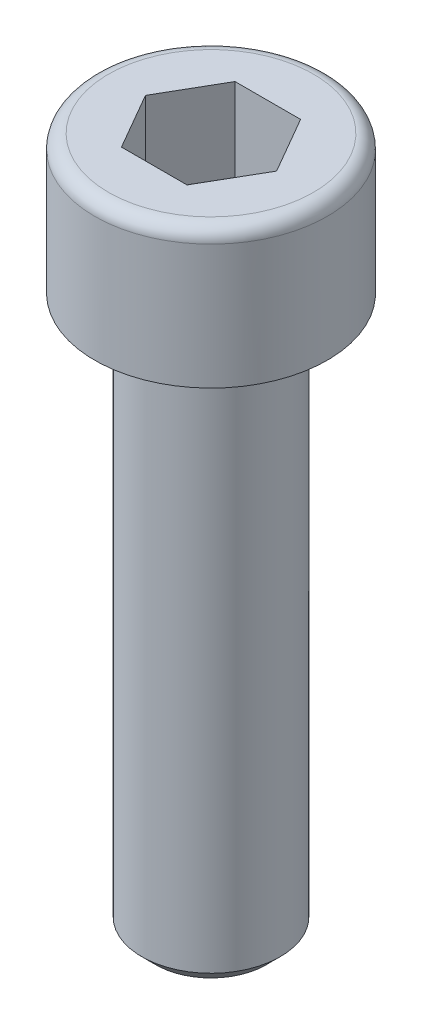
ISO-10303-21;
HEADER;
FILE_DESCRIPTION(('STEP AP214'),'2;1');
FILE_NAME('part.step','',(''),(''),'','','');
FILE_SCHEMA(('AUTOMOTIVE_DESIGN { 1 0 10303 214 1 1 1 1 }'));
ENDSEC;
DATA;
#1=APPLICATION_CONTEXT('core data for automotive mechanical design processes');
#2=APPLICATION_PROTOCOL_DEFINITION('international standard','automotive_design',2000,#1);
#3=PRODUCT_CONTEXT('',#1,'mechanical');
#4=PRODUCT('Part','Part','',(#3));
#5=PRODUCT_RELATED_PRODUCT_CATEGORY('part','',(#4));
#6=PRODUCT_DEFINITION_FORMATION('','',#4);
#7=PRODUCT_DEFINITION_CONTEXT('part definition',#1,'design');
#8=PRODUCT_DEFINITION('design','',#6,#7);
#9=PRODUCT_DEFINITION_SHAPE('','',#8);
#10=(LENGTH_UNIT() NAMED_UNIT(*) SI_UNIT(.MILLI.,.METRE.));
#11=(NAMED_UNIT(*) PLANE_ANGLE_UNIT() SI_UNIT($,.RADIAN.));
#12=(NAMED_UNIT(*) SI_UNIT($,.STERADIAN.) SOLID_ANGLE_UNIT());
#13=UNCERTAINTY_MEASURE_WITH_UNIT(LENGTH_MEASURE(1.E-05),#10,'distance_accuracy_value','');
#14=(GEOMETRIC_REPRESENTATION_CONTEXT(3) GLOBAL_UNCERTAINTY_ASSIGNED_CONTEXT((#13)) GLOBAL_UNIT_ASSIGNED_CONTEXT((#10,
#11,#12)) REPRESENTATION_CONTEXT('',''));
#15=CARTESIAN_POINT('',(0.,0.,0.));
#16=DIRECTION('',(0.,0.,1.));
#17=DIRECTION('',(1.,0.,0.));
#18=AXIS2_PLACEMENT_3D('',#15,#16,#17);
#19=CARTESIAN_POINT('',(0.,0.,0.));
#20=DIRECTION('',(0.,-1.,0.));
#21=DIRECTION('',(0.,0.,-1.));
#22=AXIS2_PLACEMENT_3D('',#19,#20,#21);
#23=PLANE('',#22);
#24=CARTESIAN_POINT('',(0.,0.,0.));
#25=DIRECTION('',(0.,-1.,0.));
#26=DIRECTION('',(0.,0.,-1.));
#27=AXIS2_PLACEMENT_3D('',#24,#25,#26);
#28=CIRCLE('',#27,4.2);
#29=CARTESIAN_POINT('',(0.,0.,-4.2));
#30=VERTEX_POINT('',#29);
#31=EDGE_CURVE('E142',#30,#30,#28,.T.);
#32=ORIENTED_EDGE('',*,*,#31,.T.);
#33=EDGE_LOOP('',(#32));
#34=FACE_BOUND('',#33,.T.);
#35=CARTESIAN_POINT('',(0.,0.,0.));
#36=DIRECTION('',(0.,-1.,0.));
#37=DIRECTION('',(0.,0.,-1.));
#38=AXIS2_PLACEMENT_3D('',#35,#36,#37);
#39=CIRCLE('',#38,2.5);
#40=CARTESIAN_POINT('',(0.,0.,-2.5));
#41=VERTEX_POINT('',#40);
#42=EDGE_CURVE('E134',#41,#41,#39,.T.);
#43=ORIENTED_EDGE('',*,*,#42,.F.);
#44=EDGE_LOOP('',(#43));
#45=FACE_BOUND('',#44,.T.);
#46=ADVANCED_FACE('F32',(#34,#45),#23,.T.);
#47=CARTESIAN_POINT('',(0.,5.,0.));
#48=DIRECTION('',(0.,-1.,0.));
#49=DIRECTION('',(0.,0.,-1.));
#50=AXIS2_PLACEMENT_3D('',#47,#48,#49);
#51=CYLINDRICAL_SURFACE('',#50,4.2);
#52=CARTESIAN_POINT('',(0.,4.5,0.));
#53=DIRECTION('',(0.,1.,0.));
#54=DIRECTION('',(0.,0.,1.));
#55=AXIS2_PLACEMENT_3D('',#52,#53,#54);
#56=CIRCLE('',#55,4.2);
#57=CARTESIAN_POINT('',(0.,4.5,4.2));
#58=VERTEX_POINT('',#57);
#59=EDGE_CURVE('E40',#58,#58,#56,.F.);
#60=ORIENTED_EDGE('',*,*,#59,.T.);
#61=EDGE_LOOP('',(#60));
#62=FACE_BOUND('',#61,.T.);
#63=ORIENTED_EDGE('',*,*,#31,.F.);
#64=EDGE_LOOP('',(#63));
#65=FACE_BOUND('',#64,.T.);
#66=ADVANCED_FACE('F153',(#62,#65),#51,.T.);
#67=CARTESIAN_POINT('',(4.2,5.,0.));
#68=DIRECTION('',(0.,1.,0.));
#69=DIRECTION('',(0.,0.,1.));
#70=AXIS2_PLACEMENT_3D('',#67,#68,#69);
#71=PLANE('',#70);
#72=CARTESIAN_POINT('',(0.,5.,0.));
#73=DIRECTION('',(0.,1.,0.));
#74=DIRECTION('',(0.,0.,1.));
#75=AXIS2_PLACEMENT_3D('',#72,#73,#74);
#76=CIRCLE('',#75,3.7);
#77=CARTESIAN_POINT('',(0.,5.,3.7));
#78=VERTEX_POINT('',#77);
#79=EDGE_CURVE('E11',#78,#78,#76,.T.);
#80=ORIENTED_EDGE('',*,*,#79,.T.);
#81=EDGE_LOOP('',(#80));
#82=FACE_BOUND('',#81,.T.);
#83=DIRECTION('',(0.5,0.,0.866025403784439));
#84=VECTOR('',#83,1.);
#85=CARTESIAN_POINT('',(-2.36713610367747,5.,0.));
#86=LINE('',#85,#84);
#87=CARTESIAN_POINT('',(-2.36713610367747,5.,0.));
#88=VERTEX_POINT('',#87);
#89=CARTESIAN_POINT('',(-1.18356805183873,5.,2.05));
#90=VERTEX_POINT('',#89);
#91=EDGE_CURVE('E47',#88,#90,#86,.T.);
#92=ORIENTED_EDGE('',*,*,#91,.F.);
#93=DIRECTION('',(-0.5,0.,0.866025403784439));
#94=VECTOR('',#93,1.);
#95=CARTESIAN_POINT('',(-1.18356805183873,5.,-2.05));
#96=LINE('',#95,#94);
#97=CARTESIAN_POINT('',(-1.18356805183873,5.,-2.05));
#98=VERTEX_POINT('',#97);
#99=EDGE_CURVE('E130',#98,#88,#96,.T.);
#100=ORIENTED_EDGE('',*,*,#99,.F.);
#101=DIRECTION('',(-1.,0.,0.));
#102=VECTOR('',#101,1.);
#103=CARTESIAN_POINT('',(1.18356805183873,5.,-2.05));
#104=LINE('',#103,#102);
#105=CARTESIAN_POINT('',(1.18356805183873,5.,-2.05));
#106=VERTEX_POINT('',#105);
#107=EDGE_CURVE('E128',#106,#98,#104,.T.);
#108=ORIENTED_EDGE('',*,*,#107,.F.);
#109=DIRECTION('',(-0.5,0.,-0.866025403784439));
#110=VECTOR('',#109,1.);
#111=CARTESIAN_POINT('',(2.36713610367747,5.,0.));
#112=LINE('',#111,#110);
#113=CARTESIAN_POINT('',(2.36713610367747,5.,0.));
#114=VERTEX_POINT('',#113);
#115=EDGE_CURVE('E95',#114,#106,#112,.T.);
#116=ORIENTED_EDGE('',*,*,#115,.F.);
#117=DIRECTION('',(0.5,0.,-0.866025403784439));
#118=VECTOR('',#117,1.);
#119=CARTESIAN_POINT('',(1.18356805183873,5.,2.05));
#120=LINE('',#119,#118);
#121=CARTESIAN_POINT('',(1.18356805183873,5.,2.05));
#122=VERTEX_POINT('',#121);
#123=EDGE_CURVE('E124',#122,#114,#120,.T.);
#124=ORIENTED_EDGE('',*,*,#123,.F.);
#125=DIRECTION('',(1.,0.,0.));
#126=VECTOR('',#125,1.);
#127=CARTESIAN_POINT('',(-1.18356805183873,5.,2.05));
#128=LINE('',#127,#126);
#129=EDGE_CURVE('E121',#90,#122,#128,.T.);
#130=ORIENTED_EDGE('',*,*,#129,.F.);
#131=EDGE_LOOP('',(#92,#100,#108,#116,#124,#130));
#132=FACE_BOUND('',#131,.T.);
#133=ADVANCED_FACE('F170',(#82,#132),#71,.T.);
#134=CARTESIAN_POINT('',(0.,-20.,0.));
#135=DIRECTION('',(0.,1.,0.));
#136=DIRECTION('',(0.,0.,1.));
#137=AXIS2_PLACEMENT_3D('',#134,#135,#136);
#138=CYLINDRICAL_SURFACE('',#137,2.5);
#139=CARTESIAN_POINT('',(0.,-19.5,0.));
#140=DIRECTION('',(0.,-1.,0.));
#141=DIRECTION('',(0.,0.,-1.));
#142=AXIS2_PLACEMENT_3D('',#139,#140,#141);
#143=CIRCLE('',#142,2.5);
#144=CARTESIAN_POINT('',(0.,-19.5,-2.5));
#145=VERTEX_POINT('',#144);
#146=EDGE_CURVE('E148',#145,#145,#143,.F.);
#147=ORIENTED_EDGE('',*,*,#146,.T.);
#148=EDGE_LOOP('',(#147));
#149=FACE_BOUND('',#148,.T.);
#150=ORIENTED_EDGE('',*,*,#42,.T.);
#151=EDGE_LOOP('',(#150));
#152=FACE_BOUND('',#151,.T.);
#153=ADVANCED_FACE('F175',(#149,#152),#138,.T.);
#154=CARTESIAN_POINT('',(0.,-20.,0.));
#155=DIRECTION('',(0.,-1.,0.));
#156=DIRECTION('',(0.,0.,-1.));
#157=AXIS2_PLACEMENT_3D('',#154,#155,#156);
#158=PLANE('',#157);
#159=CARTESIAN_POINT('',(0.,-20.,0.));
#160=DIRECTION('',(0.,-1.,0.));
#161=DIRECTION('',(0.,0.,-1.));
#162=AXIS2_PLACEMENT_3D('',#159,#160,#161);
#163=CIRCLE('',#162,2.00000000000001);
#164=CARTESIAN_POINT('',(0.,-20.,-2.00000000000001));
#165=VERTEX_POINT('',#164);
#166=EDGE_CURVE('E145',#165,#165,#163,.T.);
#167=ORIENTED_EDGE('',*,*,#166,.T.);
#168=EDGE_LOOP('',(#167));
#169=FACE_BOUND('',#168,.T.);
#170=ADVANCED_FACE('F182',(#169),#158,.T.);
#171=CARTESIAN_POINT('',(-2.36713610367747,2.,0.));
#172=DIRECTION('',(-0.866025403784439,0.,0.5));
#173=DIRECTION('',(0.5,0.,0.866025403784439));
#174=AXIS2_PLACEMENT_3D('',#171,#172,#173);
#175=PLANE('',#174);
#176=ORIENTED_EDGE('',*,*,#91,.T.);
#177=DIRECTION('',(0.,1.,0.));
#178=VECTOR('',#177,1.);
#179=CARTESIAN_POINT('',(-1.18356805183873,2.,2.05));
#180=LINE('',#179,#178);
#181=CARTESIAN_POINT('',(-1.18356805183873,2.,2.05));
#182=VERTEX_POINT('',#181);
#183=EDGE_CURVE('E77',#182,#90,#180,.T.);
#184=ORIENTED_EDGE('',*,*,#183,.F.);
#185=DIRECTION('',(0.5,0.,0.866025403784439));
#186=VECTOR('',#185,1.);
#187=CARTESIAN_POINT('',(-2.36713610367747,2.,0.));
#188=LINE('',#187,#186);
#189=CARTESIAN_POINT('',(-2.36713610367747,2.,0.));
#190=VERTEX_POINT('',#189);
#191=EDGE_CURVE('E132',#190,#182,#188,.T.);
#192=ORIENTED_EDGE('',*,*,#191,.F.);
#193=DIRECTION('',(0.,1.,0.));
#194=VECTOR('',#193,1.);
#195=CARTESIAN_POINT('',(-2.36713610367747,2.,0.));
#196=LINE('',#195,#194);
#197=EDGE_CURVE('E55',#190,#88,#196,.T.);
#198=ORIENTED_EDGE('',*,*,#197,.T.);
#199=EDGE_LOOP('',(#176,#184,#192,#198));
#200=FACE_BOUND('',#199,.T.);
#201=ADVANCED_FACE('F191',(#200),#175,.F.);
#202=CARTESIAN_POINT('',(-1.18356805183873,2.,-2.05));
#203=DIRECTION('',(-0.866025403784438,0.,-0.5));
#204=DIRECTION('',(-0.5,0.,0.866025403784439));
#205=AXIS2_PLACEMENT_3D('',#202,#203,#204);
#206=PLANE('',#205);
#207=ORIENTED_EDGE('',*,*,#99,.T.);
#208=ORIENTED_EDGE('',*,*,#197,.F.);
#209=DIRECTION('',(-0.5,0.,0.866025403784439));
#210=VECTOR('',#209,1.);
#211=CARTESIAN_POINT('',(-1.18356805183873,2.,-2.05));
#212=LINE('',#211,#210);
#213=CARTESIAN_POINT('',(-1.18356805183873,2.,-2.05));
#214=VERTEX_POINT('',#213);
#215=EDGE_CURVE('E107',#214,#190,#212,.T.);
#216=ORIENTED_EDGE('',*,*,#215,.F.);
#217=DIRECTION('',(0.,1.,0.));
#218=VECTOR('',#217,1.);
#219=CARTESIAN_POINT('',(-1.18356805183873,2.,-2.05));
#220=LINE('',#219,#218);
#221=EDGE_CURVE('E99',#214,#98,#220,.T.);
#222=ORIENTED_EDGE('',*,*,#221,.T.);
#223=EDGE_LOOP('',(#207,#208,#216,#222));
#224=FACE_BOUND('',#223,.T.);
#225=ADVANCED_FACE('F193',(#224),#206,.F.);
#226=CARTESIAN_POINT('',(1.18356805183873,2.,-2.05));
#227=DIRECTION('',(0.,0.,-1.));
#228=DIRECTION('',(-1.,0.,0.));
#229=AXIS2_PLACEMENT_3D('',#226,#227,#228);
#230=PLANE('',#229);
#231=ORIENTED_EDGE('',*,*,#107,.T.);
#232=ORIENTED_EDGE('',*,*,#221,.F.);
#233=DIRECTION('',(-1.,0.,0.));
#234=VECTOR('',#233,1.);
#235=CARTESIAN_POINT('',(1.18356805183873,2.,-2.05));
#236=LINE('',#235,#234);
#237=CARTESIAN_POINT('',(1.18356805183873,2.,-2.05));
#238=VERTEX_POINT('',#237);
#239=EDGE_CURVE('E103',#238,#214,#236,.T.);
#240=ORIENTED_EDGE('',*,*,#239,.F.);
#241=DIRECTION('',(0.,1.,0.));
#242=VECTOR('',#241,1.);
#243=CARTESIAN_POINT('',(1.18356805183873,2.,-2.05));
#244=LINE('',#243,#242);
#245=EDGE_CURVE('E88',#238,#106,#244,.T.);
#246=ORIENTED_EDGE('',*,*,#245,.T.);
#247=EDGE_LOOP('',(#231,#232,#240,#246));
#248=FACE_BOUND('',#247,.T.);
#249=ADVANCED_FACE('F104',(#248),#230,.F.);
#250=CARTESIAN_POINT('',(2.36713610367747,2.,0.));
#251=DIRECTION('',(0.866025403784438,0.,-0.5));
#252=DIRECTION('',(-0.5,0.,-0.866025403784439));
#253=AXIS2_PLACEMENT_3D('',#250,#251,#252);
#254=PLANE('',#253);
#255=ORIENTED_EDGE('',*,*,#115,.T.);
#256=ORIENTED_EDGE('',*,*,#245,.F.);
#257=DIRECTION('',(-0.5,0.,-0.866025403784439));
#258=VECTOR('',#257,1.);
#259=CARTESIAN_POINT('',(2.36713610367747,2.,0.));
#260=LINE('',#259,#258);
#261=CARTESIAN_POINT('',(2.36713610367747,2.,0.));
#262=VERTEX_POINT('',#261);
#263=EDGE_CURVE('E92',#262,#238,#260,.T.);
#264=ORIENTED_EDGE('',*,*,#263,.F.);
#265=DIRECTION('',(0.,1.,0.));
#266=VECTOR('',#265,1.);
#267=CARTESIAN_POINT('',(2.36713610367747,2.,0.));
#268=LINE('',#267,#266);
#269=EDGE_CURVE('E100',#262,#114,#268,.T.);
#270=ORIENTED_EDGE('',*,*,#269,.T.);
#271=EDGE_LOOP('',(#255,#256,#264,#270));
#272=FACE_BOUND('',#271,.T.);
#273=ADVANCED_FACE('F90',(#272),#254,.F.);
#274=CARTESIAN_POINT('',(1.18356805183873,2.,2.05));
#275=DIRECTION('',(0.866025403784439,0.,0.5));
#276=DIRECTION('',(0.5,0.,-0.866025403784439));
#277=AXIS2_PLACEMENT_3D('',#274,#275,#276);
#278=PLANE('',#277);
#279=ORIENTED_EDGE('',*,*,#123,.T.);
#280=ORIENTED_EDGE('',*,*,#269,.F.);
#281=DIRECTION('',(0.5,0.,-0.866025403784439));
#282=VECTOR('',#281,1.);
#283=CARTESIAN_POINT('',(1.18356805183873,2.,2.05));
#284=LINE('',#283,#282);
#285=CARTESIAN_POINT('',(1.18356805183873,2.,2.05));
#286=VERTEX_POINT('',#285);
#287=EDGE_CURVE('E113',#286,#262,#284,.T.);
#288=ORIENTED_EDGE('',*,*,#287,.F.);
#289=DIRECTION('',(0.,1.,0.));
#290=VECTOR('',#289,1.);
#291=CARTESIAN_POINT('',(1.18356805183873,2.,2.05));
#292=LINE('',#291,#290);
#293=EDGE_CURVE('E137',#286,#122,#292,.T.);
#294=ORIENTED_EDGE('',*,*,#293,.T.);
#295=EDGE_LOOP('',(#279,#280,#288,#294));
#296=FACE_BOUND('',#295,.T.);
#297=ADVANCED_FACE('F204',(#296),#278,.F.);
#298=CARTESIAN_POINT('',(-1.18356805183873,2.,2.05));
#299=DIRECTION('',(0.,0.,1.));
#300=DIRECTION('',(1.,0.,0.));
#301=AXIS2_PLACEMENT_3D('',#298,#299,#300);
#302=PLANE('',#301);
#303=ORIENTED_EDGE('',*,*,#129,.T.);
#304=ORIENTED_EDGE('',*,*,#293,.F.);
#305=DIRECTION('',(1.,0.,0.));
#306=VECTOR('',#305,1.);
#307=CARTESIAN_POINT('',(-1.18356805183873,2.,2.05));
#308=LINE('',#307,#306);
#309=EDGE_CURVE('E115',#182,#286,#308,.T.);
#310=ORIENTED_EDGE('',*,*,#309,.F.);
#311=ORIENTED_EDGE('',*,*,#183,.T.);
#312=EDGE_LOOP('',(#303,#304,#310,#311));
#313=FACE_BOUND('',#312,.T.);
#314=ADVANCED_FACE('F189',(#313),#302,.F.);
#315=CARTESIAN_POINT('',(0.,2.,0.));
#316=DIRECTION('',(0.,1.,0.));
#317=DIRECTION('',(0.,0.,1.));
#318=AXIS2_PLACEMENT_3D('',#315,#316,#317);
#319=PLANE('',#318);
#320=ORIENTED_EDGE('',*,*,#191,.T.);
#321=ORIENTED_EDGE('',*,*,#309,.T.);
#322=ORIENTED_EDGE('',*,*,#287,.T.);
#323=ORIENTED_EDGE('',*,*,#263,.T.);
#324=ORIENTED_EDGE('',*,*,#239,.T.);
#325=ORIENTED_EDGE('',*,*,#215,.T.);
#326=EDGE_LOOP('',(#320,#321,#322,#323,#324,#325));
#327=FACE_BOUND('',#326,.T.);
#328=ADVANCED_FACE('F110',(#327),#319,.T.);
#329=CARTESIAN_POINT('',(0.,-20.,0.));
#330=DIRECTION('',(0.,1.,0.));
#331=DIRECTION('',(0.,0.,1.));
#332=AXIS2_PLACEMENT_3D('',#329,#330,#331);
#333=CONICAL_SURFACE('',#332,2.00000000000001,0.785398163397446);
#334=ORIENTED_EDGE('',*,*,#146,.F.);
#335=EDGE_LOOP('',(#334));
#336=FACE_BOUND('',#335,.T.);
#337=ORIENTED_EDGE('',*,*,#166,.F.);
#338=EDGE_LOOP('',(#337));
#339=FACE_BOUND('',#338,.T.);
#340=ADVANCED_FACE('F157',(#336,#339),#333,.T.);
#341=CARTESIAN_POINT('',(0.,4.5,0.));
#342=DIRECTION('',(0.,1.,0.));
#343=DIRECTION('',(0.,0.,1.));
#344=AXIS2_PLACEMENT_3D('',#341,#342,#343);
#345=TOROIDAL_SURFACE('',#344,3.7,0.5);
#346=ORIENTED_EDGE('',*,*,#79,.F.);
#347=EDGE_LOOP('',(#346));
#348=FACE_BOUND('',#347,.T.);
#349=ORIENTED_EDGE('',*,*,#59,.F.);
#350=EDGE_LOOP('',(#349));
#351=FACE_BOUND('',#350,.T.);
#352=ADVANCED_FACE('F34',(#348,#351),#345,.T.);
#353=CLOSED_SHELL('',(#46,#66,#133,#153,#170,#201,#225,#249,#273,#297,#314,#328,#340,#352));
#354=MANIFOLD_SOLID_BREP('B2',#353);
#355=ADVANCED_BREP_SHAPE_REPRESENTATION('',(#18,#354),#14);
#356=SHAPE_DEFINITION_REPRESENTATION(#9,#355);
ENDSEC;
END-ISO-10303-21;
